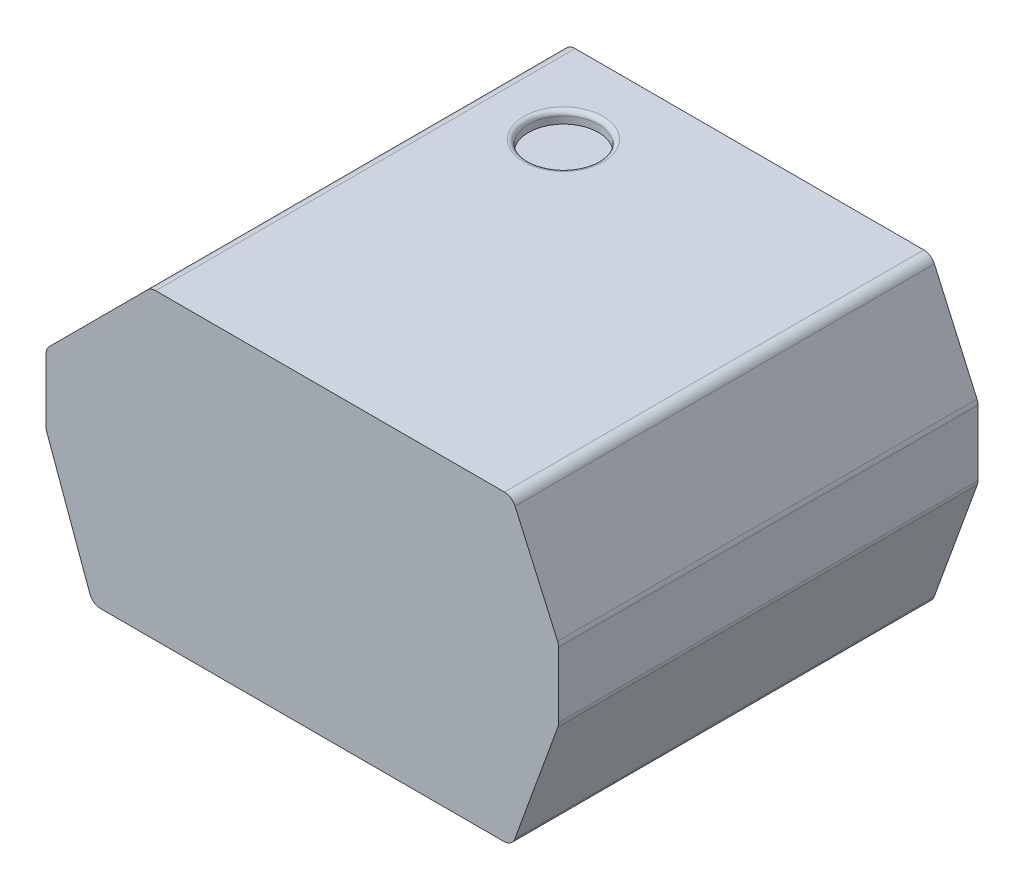
ISO-10303-21;
HEADER;
FILE_DESCRIPTION(('STEP AP214'),'2;1');
FILE_NAME('part.step','',(''),(''),'','','');
FILE_SCHEMA(('AUTOMOTIVE_DESIGN { 1 0 10303 214 1 1 1 1 }'));
ENDSEC;
DATA;
#1=APPLICATION_CONTEXT('core data for automotive mechanical design processes');
#2=APPLICATION_PROTOCOL_DEFINITION('international standard','automotive_design',2000,#1);
#3=PRODUCT_CONTEXT('',#1,'mechanical');
#4=PRODUCT('Part','Part','',(#3));
#5=PRODUCT_RELATED_PRODUCT_CATEGORY('part','',(#4));
#6=PRODUCT_DEFINITION_FORMATION('','',#4);
#7=PRODUCT_DEFINITION_CONTEXT('part definition',#1,'design');
#8=PRODUCT_DEFINITION('design','',#6,#7);
#9=PRODUCT_DEFINITION_SHAPE('','',#8);
#10=(LENGTH_UNIT() NAMED_UNIT(*) SI_UNIT(.MILLI.,.METRE.));
#11=(NAMED_UNIT(*) PLANE_ANGLE_UNIT() SI_UNIT($,.RADIAN.));
#12=(NAMED_UNIT(*) SI_UNIT($,.STERADIAN.) SOLID_ANGLE_UNIT());
#13=UNCERTAINTY_MEASURE_WITH_UNIT(LENGTH_MEASURE(1.E-05),#10,'distance_accuracy_value','');
#14=(GEOMETRIC_REPRESENTATION_CONTEXT(3) GLOBAL_UNCERTAINTY_ASSIGNED_CONTEXT((#13)) GLOBAL_UNIT_ASSIGNED_CONTEXT((#10,
#11,#12)) REPRESENTATION_CONTEXT('',''));
#15=CARTESIAN_POINT('',(0.,0.,0.));
#16=DIRECTION('',(0.,0.,1.));
#17=DIRECTION('',(1.,0.,0.));
#18=AXIS2_PLACEMENT_3D('',#15,#16,#17);
#19=CARTESIAN_POINT('',(1.56556133875729,2.6,0.723348656637227));
#20=DIRECTION('',(0.,1.,0.));
#21=DIRECTION('',(-1.,0.,0.));
#22=AXIS2_PLACEMENT_3D('',#19,#20,#21);
#23=PLANE('',#22);
#24=CARTESIAN_POINT('',(1.56556133875729,2.6,0.723348656637227));
#25=DIRECTION('',(0.,1.,0.));
#26=DIRECTION('',(-1.,0.,0.));
#27=AXIS2_PLACEMENT_3D('',#24,#25,#26);
#28=CIRCLE('',#27,0.3);
#29=CARTESIAN_POINT('',(1.26556133875729,2.6,0.723348656637227));
#30=VERTEX_POINT('',#29);
#31=EDGE_CURVE('E151',#30,#30,#28,.T.);
#32=ORIENTED_EDGE('',*,*,#31,.T.);
#33=EDGE_LOOP('',(#32));
#34=FACE_BOUND('',#33,.T.);
#35=ADVANCED_FACE('F16',(#34),#23,.T.);
#36=CARTESIAN_POINT('',(4.3,1.7787785549551,3.6));
#37=DIRECTION('',(0.,0.,-1.));
#38=DIRECTION('',(-1.,0.,0.));
#39=AXIS2_PLACEMENT_3D('',#36,#37,#38);
#40=CYLINDRICAL_SURFACE('',#39,0.1);
#41=CARTESIAN_POINT('',(4.3,1.7787785549551,3.6));
#42=DIRECTION('',(0.,0.,-1.));
#43=DIRECTION('',(-1.,0.,0.));
#44=AXIS2_PLACEMENT_3D('',#41,#42,#43);
#45=CIRCLE('',#44,0.1);
#46=CARTESIAN_POINT('',(4.39138115486203,1.81939240156044,3.6));
#47=VERTEX_POINT('',#46);
#48=CARTESIAN_POINT('',(4.4,1.7787785549551,3.6));
#49=VERTEX_POINT('',#48);
#50=EDGE_CURVE('E141',#47,#49,#45,.T.);
#51=ORIENTED_EDGE('',*,*,#50,.T.);
#52=DIRECTION('',(0.,0.,1.));
#53=VECTOR('',#52,1.);
#54=CARTESIAN_POINT('',(4.4,1.7787785549551,3.6));
#55=LINE('',#54,#53);
#56=CARTESIAN_POINT('',(4.4,1.7787785549551,0.));
#57=VERTEX_POINT('',#56);
#58=EDGE_CURVE('E140',#49,#57,#55,.F.);
#59=ORIENTED_EDGE('',*,*,#58,.T.);
#60=CARTESIAN_POINT('',(4.3,1.7787785549551,0.));
#61=DIRECTION('',(0.,0.,-1.));
#62=DIRECTION('',(-1.,0.,0.));
#63=AXIS2_PLACEMENT_3D('',#60,#61,#62);
#64=CIRCLE('',#63,0.1);
#65=CARTESIAN_POINT('',(4.39138115486203,1.81939240156044,0.));
#66=VERTEX_POINT('',#65);
#67=EDGE_CURVE('E131',#57,#66,#64,.F.);
#68=ORIENTED_EDGE('',*,*,#67,.T.);
#69=DIRECTION('',(0.,0.,1.));
#70=VECTOR('',#69,1.);
#71=CARTESIAN_POINT('',(4.39138115486203,1.81939240156044,3.6));
#72=LINE('',#71,#70);
#73=EDGE_CURVE('E138',#66,#47,#72,.T.);
#74=ORIENTED_EDGE('',*,*,#73,.T.);
#75=EDGE_LOOP('',(#51,#59,#68,#74));
#76=FACE_BOUND('',#75,.T.);
#77=ADVANCED_FACE('F137',(#76),#40,.T.);
#78=CARTESIAN_POINT('',(0.1,1.75857864376269,3.6));
#79=DIRECTION('',(0.,0.,-1.));
#80=DIRECTION('',(-1.,0.,0.));
#81=AXIS2_PLACEMENT_3D('',#78,#79,#80);
#82=CYLINDRICAL_SURFACE('',#81,0.1);
#83=CARTESIAN_POINT('',(0.1,1.75857864376269,3.6));
#84=DIRECTION('',(0.,0.,-1.));
#85=DIRECTION('',(-1.,0.,0.));
#86=AXIS2_PLACEMENT_3D('',#83,#84,#85);
#87=CIRCLE('',#86,0.1);
#88=CARTESIAN_POINT('',(0.,1.75857864376269,3.6));
#89=VERTEX_POINT('',#88);
#90=CARTESIAN_POINT('',(0.0292893218813454,1.82928932188135,3.6));
#91=VERTEX_POINT('',#90);
#92=EDGE_CURVE('E196',#89,#91,#87,.T.);
#93=ORIENTED_EDGE('',*,*,#92,.T.);
#94=DIRECTION('',(0.,0.,1.));
#95=VECTOR('',#94,1.);
#96=CARTESIAN_POINT('',(0.0292893218813456,1.82928932188135,3.6));
#97=LINE('',#96,#95);
#98=CARTESIAN_POINT('',(0.0292893218813454,1.82928932188135,0.));
#99=VERTEX_POINT('',#98);
#100=EDGE_CURVE('E160',#91,#99,#97,.F.);
#101=ORIENTED_EDGE('',*,*,#100,.T.);
#102=CARTESIAN_POINT('',(0.1,1.75857864376269,0.));
#103=DIRECTION('',(0.,0.,-1.));
#104=DIRECTION('',(-1.,0.,0.));
#105=AXIS2_PLACEMENT_3D('',#102,#103,#104);
#106=CIRCLE('',#105,0.1);
#107=CARTESIAN_POINT('',(0.,1.75857864376269,0.));
#108=VERTEX_POINT('',#107);
#109=EDGE_CURVE('E226',#99,#108,#106,.F.);
#110=ORIENTED_EDGE('',*,*,#109,.T.);
#111=DIRECTION('',(0.,0.,1.));
#112=VECTOR('',#111,1.);
#113=CARTESIAN_POINT('',(0.,1.75857864376269,3.6));
#114=LINE('',#113,#112);
#115=EDGE_CURVE('E183',#108,#89,#114,.T.);
#116=ORIENTED_EDGE('',*,*,#115,.T.);
#117=EDGE_LOOP('',(#93,#101,#110,#116));
#118=FACE_BOUND('',#117,.T.);
#119=ADVANCED_FACE('F376',(#118),#82,.T.);
#120=CARTESIAN_POINT('',(0.,1.75857864376269,3.6));
#121=DIRECTION('',(1.,0.,0.));
#122=DIRECTION('',(0.,1.,0.));
#123=AXIS2_PLACEMENT_3D('',#120,#121,#122);
#124=PLANE('',#123);
#125=DIRECTION('',(0.,0.,-1.));
#126=VECTOR('',#125,1.);
#127=CARTESIAN_POINT('',(0.,1.21761749776799,3.6));
#128=LINE('',#127,#126);
#129=CARTESIAN_POINT('',(0.,1.21761749776799,3.6));
#130=VERTEX_POINT('',#129);
#131=CARTESIAN_POINT('',(0.,1.21761749776799,0.));
#132=VERTEX_POINT('',#131);
#133=EDGE_CURVE('E184',#130,#132,#128,.T.);
#134=ORIENTED_EDGE('',*,*,#133,.F.);
#135=DIRECTION('',(0.,1.,0.));
#136=VECTOR('',#135,1.);
#137=CARTESIAN_POINT('',(0.,1.75857864376269,3.6));
#138=LINE('',#137,#136);
#139=EDGE_CURVE('E180',#89,#130,#138,.F.);
#140=ORIENTED_EDGE('',*,*,#139,.F.);
#141=ORIENTED_EDGE('',*,*,#115,.F.);
#142=DIRECTION('',(0.,1.,0.));
#143=VECTOR('',#142,1.);
#144=CARTESIAN_POINT('',(0.,1.75857864376269,0.));
#145=LINE('',#144,#143);
#146=EDGE_CURVE('E177',#132,#108,#145,.T.);
#147=ORIENTED_EDGE('',*,*,#146,.F.);
#148=EDGE_LOOP('',(#134,#140,#141,#147));
#149=FACE_BOUND('',#148,.T.);
#150=ADVANCED_FACE('F373',(#149),#124,.F.);
#151=CARTESIAN_POINT('',(4.4,1.21761749776799,3.6));
#152=DIRECTION('',(-1.,0.,0.));
#153=DIRECTION('',(0.,0.,1.));
#154=AXIS2_PLACEMENT_3D('',#151,#152,#153);
#155=PLANE('',#154);
#156=ORIENTED_EDGE('',*,*,#58,.F.);
#157=DIRECTION('',(0.,1.,0.));
#158=VECTOR('',#157,1.);
#159=CARTESIAN_POINT('',(4.4,1.21761749776799,3.6));
#160=LINE('',#159,#158);
#161=CARTESIAN_POINT('',(4.4,1.21761749776799,3.6));
#162=VERTEX_POINT('',#161);
#163=EDGE_CURVE('E174',#162,#49,#160,.T.);
#164=ORIENTED_EDGE('',*,*,#163,.F.);
#165=DIRECTION('',(0.,0.,-1.));
#166=VECTOR('',#165,1.);
#167=CARTESIAN_POINT('',(4.4,1.21761749776799,3.6));
#168=LINE('',#167,#166);
#169=CARTESIAN_POINT('',(4.4,1.21761749776799,0.));
#170=VERTEX_POINT('',#169);
#171=EDGE_CURVE('E170',#170,#162,#168,.F.);
#172=ORIENTED_EDGE('',*,*,#171,.F.);
#173=DIRECTION('',(0.,1.,0.));
#174=VECTOR('',#173,1.);
#175=CARTESIAN_POINT('',(4.4,1.21761749776799,0.));
#176=LINE('',#175,#174);
#177=EDGE_CURVE('E178',#57,#170,#176,.F.);
#178=ORIENTED_EDGE('',*,*,#177,.F.);
#179=EDGE_LOOP('',(#156,#164,#172,#178));
#180=FACE_BOUND('',#179,.T.);
#181=ADVANCED_FACE('F360',(#180),#155,.F.);
#182=CARTESIAN_POINT('',(1.56556133875729,2.6,0.723348656637227));
#183=DIRECTION('',(0.,1.,0.));
#184=DIRECTION('',(-1.,0.,0.));
#185=AXIS2_PLACEMENT_3D('',#182,#183,#184);
#186=CYLINDRICAL_SURFACE('',#185,0.3);
#187=ORIENTED_EDGE('',*,*,#31,.F.);
#188=EDGE_LOOP('',(#187));
#189=FACE_BOUND('',#188,.T.);
#190=CARTESIAN_POINT('',(1.56556133875729,2.66,0.723348656637227));
#191=DIRECTION('',(0.,-1.,0.));
#192=DIRECTION('',(1.,0.,0.));
#193=AXIS2_PLACEMENT_3D('',#190,#191,#192);
#194=CIRCLE('',#193,0.3);
#195=CARTESIAN_POINT('',(1.86556133875729,2.66,0.723348656637227));
#196=VERTEX_POINT('',#195);
#197=EDGE_CURVE('E166',#196,#196,#194,.T.);
#198=ORIENTED_EDGE('',*,*,#197,.F.);
#199=EDGE_LOOP('',(#198));
#200=FACE_BOUND('',#199,.T.);
#201=ADVANCED_FACE('F451',(#189,#200),#186,.F.);
#202=CARTESIAN_POINT('',(4.39138115486203,1.81939240156044,3.6));
#203=DIRECTION('',(-0.913811548620257,-0.406138466053447,0.));
#204=DIRECTION('',(0.406138466053447,-0.913811548620257,0.));
#205=AXIS2_PLACEMENT_3D('',#202,#203,#204);
#206=PLANE('',#205);
#207=DIRECTION('',(0.,0.,-1.));
#208=VECTOR('',#207,1.);
#209=CARTESIAN_POINT('',(4.02639384595318,2.64061384660535,3.6));
#210=LINE('',#209,#208);
#211=CARTESIAN_POINT('',(4.02639384595318,2.64061384660535,3.6));
#212=VERTEX_POINT('',#211);
#213=CARTESIAN_POINT('',(4.02639384595318,2.64061384660535,0.));
#214=VERTEX_POINT('',#213);
#215=EDGE_CURVE('E165',#212,#214,#210,.T.);
#216=ORIENTED_EDGE('',*,*,#215,.F.);
#217=DIRECTION('',(0.406138466053447,-0.913811548620257,0.));
#218=VECTOR('',#217,1.);
#219=CARTESIAN_POINT('',(4.39138115486203,1.81939240156044,3.6));
#220=LINE('',#219,#218);
#221=EDGE_CURVE('E150',#47,#212,#220,.F.);
#222=ORIENTED_EDGE('',*,*,#221,.F.);
#223=ORIENTED_EDGE('',*,*,#73,.F.);
#224=DIRECTION('',(0.406138466053447,-0.913811548620257,0.));
#225=VECTOR('',#224,1.);
#226=CARTESIAN_POINT('',(4.39138115486203,1.81939240156044,0.));
#227=LINE('',#226,#225);
#228=EDGE_CURVE('E147',#214,#66,#227,.T.);
#229=ORIENTED_EDGE('',*,*,#228,.F.);
#230=EDGE_LOOP('',(#216,#222,#223,#229));
#231=FACE_BOUND('',#230,.T.);
#232=ADVANCED_FACE('F146',(#231),#206,.F.);
#233=CARTESIAN_POINT('',(0.870710678118654,2.67071067811865,3.6));
#234=DIRECTION('',(0.707106781186548,-0.707106781186547,0.));
#235=DIRECTION('',(0.707106781186547,0.707106781186548,0.));
#236=AXIS2_PLACEMENT_3D('',#233,#234,#235);
#237=PLANE('',#236);
#238=ORIENTED_EDGE('',*,*,#100,.F.);
#239=DIRECTION('',(0.707106781186547,0.707106781186548,0.));
#240=VECTOR('',#239,1.);
#241=CARTESIAN_POINT('',(0.870710678118654,2.67071067811865,3.6));
#242=LINE('',#241,#240);
#243=CARTESIAN_POINT('',(0.870710678118655,2.67071067811865,3.6));
#244=VERTEX_POINT('',#243);
#245=EDGE_CURVE('E157',#244,#91,#242,.F.);
#246=ORIENTED_EDGE('',*,*,#245,.F.);
#247=DIRECTION('',(0.,0.,-1.));
#248=VECTOR('',#247,1.);
#249=CARTESIAN_POINT('',(0.870710678118654,2.67071067811865,3.6));
#250=LINE('',#249,#248);
#251=CARTESIAN_POINT('',(0.870710678118655,2.67071067811865,0.));
#252=VERTEX_POINT('',#251);
#253=EDGE_CURVE('E212',#252,#244,#250,.F.);
#254=ORIENTED_EDGE('',*,*,#253,.F.);
#255=DIRECTION('',(0.707106781186547,0.707106781186548,0.));
#256=VECTOR('',#255,1.);
#257=CARTESIAN_POINT('',(0.870710678118654,2.67071067811865,0.));
#258=LINE('',#257,#256);
#259=EDGE_CURVE('E191',#99,#252,#258,.T.);
#260=ORIENTED_EDGE('',*,*,#259,.F.);
#261=EDGE_LOOP('',(#238,#246,#254,#260));
#262=FACE_BOUND('',#261,.T.);
#263=ADVANCED_FACE('F285',(#262),#237,.F.);
#264=CARTESIAN_POINT('',(0.1,1.21761749776799,3.6));
#265=DIRECTION('',(0.,0.,-1.));
#266=DIRECTION('',(-1.,0.,0.));
#267=AXIS2_PLACEMENT_3D('',#264,#265,#266);
#268=CYLINDRICAL_SURFACE('',#267,0.1);
#269=CARTESIAN_POINT('',(0.1,1.21761749776799,3.6));
#270=DIRECTION('',(0.,0.,-1.));
#271=DIRECTION('',(-1.,0.,0.));
#272=AXIS2_PLACEMENT_3D('',#269,#270,#271);
#273=CIRCLE('',#272,0.1);
#274=CARTESIAN_POINT('',(0.00602065765115637,1.18344319145932,3.6));
#275=VERTEX_POINT('',#274);
#276=EDGE_CURVE('E187',#275,#130,#273,.T.);
#277=ORIENTED_EDGE('',*,*,#276,.T.);
#278=ORIENTED_EDGE('',*,*,#133,.T.);
#279=CARTESIAN_POINT('',(0.1,1.21761749776799,0.));
#280=DIRECTION('',(0.,0.,-1.));
#281=DIRECTION('',(-1.,0.,0.));
#282=AXIS2_PLACEMENT_3D('',#279,#280,#281);
#283=CIRCLE('',#282,0.1);
#284=CARTESIAN_POINT('',(0.00602065765115637,1.18344319145932,0.));
#285=VERTEX_POINT('',#284);
#286=EDGE_CURVE('E221',#132,#285,#283,.F.);
#287=ORIENTED_EDGE('',*,*,#286,.T.);
#288=DIRECTION('',(0.,0.,1.));
#289=VECTOR('',#288,1.);
#290=CARTESIAN_POINT('',(0.00602065765115643,1.18344319145932,3.6));
#291=LINE('',#290,#289);
#292=EDGE_CURVE('E211',#285,#275,#291,.T.);
#293=ORIENTED_EDGE('',*,*,#292,.T.);
#294=EDGE_LOOP('',(#277,#278,#287,#293));
#295=FACE_BOUND('',#294,.T.);
#296=ADVANCED_FACE('F369',(#295),#268,.T.);
#297=CARTESIAN_POINT('',(4.3,1.21761749776799,3.6));
#298=DIRECTION('',(0.,0.,-1.));
#299=DIRECTION('',(-1.,0.,0.));
#300=AXIS2_PLACEMENT_3D('',#297,#298,#299);
#301=CYLINDRICAL_SURFACE('',#300,0.1);
#302=CARTESIAN_POINT('',(4.3,1.21761749776799,3.6));
#303=DIRECTION('',(0.,0.,-1.));
#304=DIRECTION('',(-1.,0.,0.));
#305=AXIS2_PLACEMENT_3D('',#302,#303,#304);
#306=CIRCLE('',#305,0.1);
#307=CARTESIAN_POINT('',(4.39397934234884,1.18344319145932,3.6));
#308=VERTEX_POINT('',#307);
#309=EDGE_CURVE('E169',#162,#308,#306,.T.);
#310=ORIENTED_EDGE('',*,*,#309,.T.);
#311=DIRECTION('',(0.,0.,1.));
#312=VECTOR('',#311,1.);
#313=CARTESIAN_POINT('',(4.39397934234884,1.18344319145932,3.6));
#314=LINE('',#313,#312);
#315=CARTESIAN_POINT('',(4.39397934234884,1.18344319145932,0.));
#316=VERTEX_POINT('',#315);
#317=EDGE_CURVE('E242',#308,#316,#314,.F.);
#318=ORIENTED_EDGE('',*,*,#317,.T.);
#319=CARTESIAN_POINT('',(4.3,1.21761749776799,0.));
#320=DIRECTION('',(0.,0.,-1.));
#321=DIRECTION('',(-1.,0.,0.));
#322=AXIS2_PLACEMENT_3D('',#319,#320,#321);
#323=CIRCLE('',#322,0.1);
#324=EDGE_CURVE('E173',#316,#170,#323,.F.);
#325=ORIENTED_EDGE('',*,*,#324,.T.);
#326=ORIENTED_EDGE('',*,*,#171,.T.);
#327=EDGE_LOOP('',(#310,#318,#325,#326));
#328=FACE_BOUND('',#327,.T.);
#329=ADVANCED_FACE('F263',(#328),#301,.T.);
#330=CARTESIAN_POINT('',(1.56556133875729,2.66,0.723348656637227));
#331=DIRECTION('',(0.,-1.,0.));
#332=DIRECTION('',(1.,0.,0.));
#333=AXIS2_PLACEMENT_3D('',#330,#331,#332);
#334=TOROIDAL_SURFACE('',#333,0.34,0.04);
#335=CARTESIAN_POINT('',(1.56556133875729,2.7,0.723348656637227));
#336=DIRECTION('',(0.,1.,0.));
#337=DIRECTION('',(1.,0.,0.));
#338=AXIS2_PLACEMENT_3D('',#335,#336,#337);
#339=CIRCLE('',#338,0.34);
#340=CARTESIAN_POINT('',(1.90556133875729,2.7,0.723348656637227));
#341=VERTEX_POINT('',#340);
#342=CARTESIAN_POINT('',(1.22556133875729,2.7,0.723348656637227));
#343=VERTEX_POINT('',#342);
#344=EDGE_CURVE('E232',#341,#343,#339,.T.);
#345=ORIENTED_EDGE('',*,*,#344,.T.);
#346=CARTESIAN_POINT('',(1.56556133875729,2.7,0.723348656637227));
#347=DIRECTION('',(0.,1.,0.));
#348=DIRECTION('',(-1.,0.,0.));
#349=AXIS2_PLACEMENT_3D('',#346,#347,#348);
#350=CIRCLE('',#349,0.34);
#351=EDGE_CURVE('E236',#343,#341,#350,.T.);
#352=ORIENTED_EDGE('',*,*,#351,.T.);
#353=EDGE_LOOP('',(#345,#352));
#354=FACE_BOUND('',#353,.T.);
#355=ORIENTED_EDGE('',*,*,#197,.T.);
#356=EDGE_LOOP('',(#355));
#357=FACE_BOUND('',#356,.T.);
#358=ADVANCED_FACE('F233',(#354,#357),#334,.T.);
#359=CARTESIAN_POINT('',(3.93501269109115,2.6,3.6));
#360=DIRECTION('',(0.,0.,-1.));
#361=DIRECTION('',(-1.,0.,0.));
#362=AXIS2_PLACEMENT_3D('',#359,#360,#361);
#363=CYLINDRICAL_SURFACE('',#362,0.0999999999999998);
#364=CARTESIAN_POINT('',(3.93501269109115,2.6,3.6));
#365=DIRECTION('',(0.,0.,-1.));
#366=DIRECTION('',(-1.,0.,0.));
#367=AXIS2_PLACEMENT_3D('',#364,#365,#366);
#368=CIRCLE('',#367,0.0999999999999998);
#369=CARTESIAN_POINT('',(3.93501269109115,2.7,3.6));
#370=VERTEX_POINT('',#369);
#371=EDGE_CURVE('E215',#370,#212,#368,.T.);
#372=ORIENTED_EDGE('',*,*,#371,.T.);
#373=ORIENTED_EDGE('',*,*,#215,.T.);
#374=CARTESIAN_POINT('',(3.93501269109115,2.6,0.));
#375=DIRECTION('',(0.,0.,-1.));
#376=DIRECTION('',(-1.,0.,0.));
#377=AXIS2_PLACEMENT_3D('',#374,#375,#376);
#378=CIRCLE('',#377,0.0999999999999998);
#379=CARTESIAN_POINT('',(3.93501269109115,2.7,0.));
#380=VERTEX_POINT('',#379);
#381=EDGE_CURVE('E156',#214,#380,#378,.F.);
#382=ORIENTED_EDGE('',*,*,#381,.T.);
#383=DIRECTION('',(0.,0.,1.));
#384=VECTOR('',#383,1.);
#385=CARTESIAN_POINT('',(3.93501269109115,2.7,3.6));
#386=LINE('',#385,#384);
#387=EDGE_CURVE('E241',#380,#370,#386,.T.);
#388=ORIENTED_EDGE('',*,*,#387,.T.);
#389=EDGE_LOOP('',(#372,#373,#382,#388));
#390=FACE_BOUND('',#389,.T.);
#391=ADVANCED_FACE('F262',(#390),#363,.T.);
#392=CARTESIAN_POINT('',(0.94142135623731,2.6,3.6));
#393=DIRECTION('',(0.,0.,-1.));
#394=DIRECTION('',(-1.,0.,0.));
#395=AXIS2_PLACEMENT_3D('',#392,#393,#394);
#396=CYLINDRICAL_SURFACE('',#395,0.0999999999999999);
#397=CARTESIAN_POINT('',(0.94142135623731,2.6,3.6));
#398=DIRECTION('',(0.,0.,-1.));
#399=DIRECTION('',(-1.,0.,0.));
#400=AXIS2_PLACEMENT_3D('',#397,#398,#399);
#401=CIRCLE('',#400,0.0999999999999999);
#402=CARTESIAN_POINT('',(0.94142135623731,2.7,3.6));
#403=VERTEX_POINT('',#402);
#404=EDGE_CURVE('E209',#244,#403,#401,.T.);
#405=ORIENTED_EDGE('',*,*,#404,.T.);
#406=DIRECTION('',(0.,0.,1.));
#407=VECTOR('',#406,1.);
#408=CARTESIAN_POINT('',(0.94142135623731,2.7,3.6));
#409=LINE('',#408,#407);
#410=CARTESIAN_POINT('',(0.94142135623731,2.7,0.));
#411=VERTEX_POINT('',#410);
#412=EDGE_CURVE('E334',#403,#411,#409,.F.);
#413=ORIENTED_EDGE('',*,*,#412,.T.);
#414=CARTESIAN_POINT('',(0.94142135623731,2.6,0.));
#415=DIRECTION('',(0.,0.,-1.));
#416=DIRECTION('',(-1.,0.,0.));
#417=AXIS2_PLACEMENT_3D('',#414,#415,#416);
#418=CIRCLE('',#417,0.0999999999999999);
#419=EDGE_CURVE('E213',#411,#252,#418,.F.);
#420=ORIENTED_EDGE('',*,*,#419,.T.);
#421=ORIENTED_EDGE('',*,*,#253,.T.);
#422=EDGE_LOOP('',(#405,#413,#420,#421));
#423=FACE_BOUND('',#422,.T.);
#424=ADVANCED_FACE('F288',(#423),#396,.T.);
#425=CARTESIAN_POINT('',(0.00602065765115643,1.18344319145932,3.6));
#426=DIRECTION('',(0.939793423488437,0.341743063086704,0.));
#427=DIRECTION('',(-0.341743063086704,0.939793423488437,0.));
#428=AXIS2_PLACEMENT_3D('',#425,#426,#427);
#429=PLANE('',#428);
#430=DIRECTION('',(0.,0.,-1.));
#431=VECTOR('',#430,1.);
#432=CARTESIAN_POINT('',(0.376063384112244,0.16582569369133,3.6));
#433=LINE('',#432,#431);
#434=CARTESIAN_POINT('',(0.376063384112244,0.16582569369133,3.6));
#435=VERTEX_POINT('',#434);
#436=CARTESIAN_POINT('',(0.376063384112244,0.16582569369133,0.));
#437=VERTEX_POINT('',#436);
#438=EDGE_CURVE('E208',#435,#437,#433,.T.);
#439=ORIENTED_EDGE('',*,*,#438,.F.);
#440=DIRECTION('',(-0.341743063086704,0.939793423488437,0.));
#441=VECTOR('',#440,1.);
#442=CARTESIAN_POINT('',(0.00602065765115643,1.18344319145932,3.6));
#443=LINE('',#442,#441);
#444=EDGE_CURVE('E252',#275,#435,#443,.F.);
#445=ORIENTED_EDGE('',*,*,#444,.F.);
#446=ORIENTED_EDGE('',*,*,#292,.F.);
#447=DIRECTION('',(-0.341743063086704,0.939793423488437,0.));
#448=VECTOR('',#447,1.);
#449=CARTESIAN_POINT('',(0.00602065765115643,1.18344319145932,0.));
#450=LINE('',#449,#448);
#451=EDGE_CURVE('E247',#437,#285,#450,.T.);
#452=ORIENTED_EDGE('',*,*,#451,.F.);
#453=EDGE_LOOP('',(#439,#445,#446,#452));
#454=FACE_BOUND('',#453,.T.);
#455=ADVANCED_FACE('F367',(#454),#429,.F.);
#456=CARTESIAN_POINT('',(4.02393661588776,0.16582569369133,3.6));
#457=DIRECTION('',(-0.939793423488437,0.341743063086705,0.));
#458=DIRECTION('',(-0.341743063086705,-0.939793423488437,0.));
#459=AXIS2_PLACEMENT_3D('',#456,#457,#458);
#460=PLANE('',#459);
#461=ORIENTED_EDGE('',*,*,#317,.F.);
#462=DIRECTION('',(0.341743063086705,0.939793423488437,0.));
#463=VECTOR('',#462,1.);
#464=CARTESIAN_POINT('',(4.02393661588776,0.16582569369133,3.6));
#465=LINE('',#464,#463);
#466=CARTESIAN_POINT('',(4.02393661588776,0.16582569369133,3.6));
#467=VERTEX_POINT('',#466);
#468=EDGE_CURVE('E207',#467,#308,#465,.T.);
#469=ORIENTED_EDGE('',*,*,#468,.F.);
#470=DIRECTION('',(0.,0.,-1.));
#471=VECTOR('',#470,1.);
#472=CARTESIAN_POINT('',(4.02393661588775,0.16582569369133,3.6));
#473=LINE('',#472,#471);
#474=CARTESIAN_POINT('',(4.02393661588776,0.16582569369133,0.));
#475=VERTEX_POINT('',#474);
#476=EDGE_CURVE('E204',#475,#467,#473,.F.);
#477=ORIENTED_EDGE('',*,*,#476,.F.);
#478=DIRECTION('',(-0.341743063086705,-0.939793423488437,0.));
#479=VECTOR('',#478,1.);
#480=CARTESIAN_POINT('',(4.02393661588776,0.16582569369133,0.));
#481=LINE('',#480,#479);
#482=EDGE_CURVE('E240',#316,#475,#481,.T.);
#483=ORIENTED_EDGE('',*,*,#482,.F.);
#484=EDGE_LOOP('',(#461,#469,#477,#483));
#485=FACE_BOUND('',#484,.T.);
#486=ADVANCED_FACE('F321',(#485),#460,.F.);
#487=CARTESIAN_POINT('',(3.93501269109115,2.7,3.6));
#488=DIRECTION('',(0.,-1.,0.));
#489=DIRECTION('',(1.,0.,0.));
#490=AXIS2_PLACEMENT_3D('',#487,#488,#489);
#491=PLANE('',#490);
#492=ORIENTED_EDGE('',*,*,#412,.F.);
#493=DIRECTION('',(1.,0.,0.));
#494=VECTOR('',#493,1.);
#495=CARTESIAN_POINT('',(0.94142135623731,2.7,3.6));
#496=LINE('',#495,#494);
#497=EDGE_CURVE('E294',#370,#403,#496,.F.);
#498=ORIENTED_EDGE('',*,*,#497,.F.);
#499=ORIENTED_EDGE('',*,*,#387,.F.);
#500=DIRECTION('',(1.,0.,0.));
#501=VECTOR('',#500,1.);
#502=CARTESIAN_POINT('',(0.94142135623731,2.7,0.));
#503=LINE('',#502,#501);
#504=EDGE_CURVE('E198',#380,#411,#503,.F.);
#505=ORIENTED_EDGE('',*,*,#504,.T.);
#506=EDGE_LOOP('',(#492,#498,#499,#505));
#507=FACE_BOUND('',#506,.T.);
#508=ORIENTED_EDGE('',*,*,#344,.F.);
#509=ORIENTED_EDGE('',*,*,#351,.F.);
#510=EDGE_LOOP('',(#508,#509));
#511=FACE_BOUND('',#510,.T.);
#512=ADVANCED_FACE('F310',(#507,#511),#491,.F.);
#513=CARTESIAN_POINT('',(0.470042726461087,0.2,3.6));
#514=DIRECTION('',(0.,0.,-1.));
#515=DIRECTION('',(-1.,0.,0.));
#516=AXIS2_PLACEMENT_3D('',#513,#514,#515);
#517=CYLINDRICAL_SURFACE('',#516,0.1);
#518=CARTESIAN_POINT('',(0.470042726461087,0.2,3.6));
#519=DIRECTION('',(0.,0.,-1.));
#520=DIRECTION('',(-1.,0.,0.));
#521=AXIS2_PLACEMENT_3D('',#518,#519,#520);
#522=CIRCLE('',#521,0.1);
#523=CARTESIAN_POINT('',(0.470042726461088,0.1,3.6));
#524=VERTEX_POINT('',#523);
#525=EDGE_CURVE('E205',#435,#524,#522,.F.);
#526=ORIENTED_EDGE('',*,*,#525,.F.);
#527=ORIENTED_EDGE('',*,*,#438,.T.);
#528=CARTESIAN_POINT('',(0.470042726461087,0.2,0.));
#529=DIRECTION('',(0.,0.,-1.));
#530=DIRECTION('',(-1.,0.,0.));
#531=AXIS2_PLACEMENT_3D('',#528,#529,#530);
#532=CIRCLE('',#531,0.1);
#533=CARTESIAN_POINT('',(0.470042726461088,0.1,0.));
#534=VERTEX_POINT('',#533);
#535=EDGE_CURVE('E199',#437,#534,#532,.F.);
#536=ORIENTED_EDGE('',*,*,#535,.T.);
#537=DIRECTION('',(0.,0.,1.));
#538=VECTOR('',#537,1.);
#539=CARTESIAN_POINT('',(0.470042726461088,0.1,3.6));
#540=LINE('',#539,#538);
#541=EDGE_CURVE('E351',#534,#524,#540,.T.);
#542=ORIENTED_EDGE('',*,*,#541,.T.);
#543=EDGE_LOOP('',(#526,#527,#536,#542));
#544=FACE_BOUND('',#543,.T.);
#545=ADVANCED_FACE('F320',(#544),#517,.T.);
#546=CARTESIAN_POINT('',(0.94142135623731,2.6,3.6));
#547=DIRECTION('',(0.,0.,1.));
#548=DIRECTION('',(1.,0.,0.));
#549=AXIS2_PLACEMENT_3D('',#546,#547,#548);
#550=PLANE('',#549);
#551=ORIENTED_EDGE('',*,*,#371,.F.);
#552=ORIENTED_EDGE('',*,*,#497,.T.);
#553=ORIENTED_EDGE('',*,*,#404,.F.);
#554=ORIENTED_EDGE('',*,*,#245,.T.);
#555=ORIENTED_EDGE('',*,*,#92,.F.);
#556=ORIENTED_EDGE('',*,*,#139,.T.);
#557=ORIENTED_EDGE('',*,*,#276,.F.);
#558=ORIENTED_EDGE('',*,*,#444,.T.);
#559=ORIENTED_EDGE('',*,*,#525,.T.);
#560=DIRECTION('',(1.,0.,0.));
#561=VECTOR('',#560,1.);
#562=CARTESIAN_POINT('',(0.470042726461088,0.1,3.6));
#563=LINE('',#562,#561);
#564=CARTESIAN_POINT('',(3.92995727353891,0.1,3.6));
#565=VERTEX_POINT('',#564);
#566=EDGE_CURVE('E302',#524,#565,#563,.T.);
#567=ORIENTED_EDGE('',*,*,#566,.T.);
#568=CARTESIAN_POINT('',(3.92995727353891,0.2,3.6));
#569=DIRECTION('',(0.,0.,-1.));
#570=DIRECTION('',(-1.,0.,0.));
#571=AXIS2_PLACEMENT_3D('',#568,#569,#570);
#572=CIRCLE('',#571,0.0999999999999998);
#573=EDGE_CURVE('E202',#467,#565,#572,.T.);
#574=ORIENTED_EDGE('',*,*,#573,.F.);
#575=ORIENTED_EDGE('',*,*,#468,.T.);
#576=ORIENTED_EDGE('',*,*,#309,.F.);
#577=ORIENTED_EDGE('',*,*,#163,.T.);
#578=ORIENTED_EDGE('',*,*,#50,.F.);
#579=ORIENTED_EDGE('',*,*,#221,.T.);
#580=EDGE_LOOP('',(#551,#552,#553,#554,#555,#556,#557,#558,#559,#567,#574,#575,#576,#577,#578,#579));
#581=FACE_BOUND('',#580,.T.);
#582=ADVANCED_FACE('F292',(#581),#550,.T.);
#583=CARTESIAN_POINT('',(3.92995727353891,0.2,3.6));
#584=DIRECTION('',(0.,0.,-1.));
#585=DIRECTION('',(-1.,0.,0.));
#586=AXIS2_PLACEMENT_3D('',#583,#584,#585);
#587=CYLINDRICAL_SURFACE('',#586,0.0999999999999998);
#588=ORIENTED_EDGE('',*,*,#573,.T.);
#589=DIRECTION('',(0.,0.,1.));
#590=VECTOR('',#589,1.);
#591=CARTESIAN_POINT('',(3.92995727353891,0.1,3.6));
#592=LINE('',#591,#590);
#593=CARTESIAN_POINT('',(3.92995727353891,0.1,0.));
#594=VERTEX_POINT('',#593);
#595=EDGE_CURVE('E27',#565,#594,#592,.F.);
#596=ORIENTED_EDGE('',*,*,#595,.T.);
#597=CARTESIAN_POINT('',(3.92995727353891,0.2,0.));
#598=DIRECTION('',(0.,0.,-1.));
#599=DIRECTION('',(-1.,0.,0.));
#600=AXIS2_PLACEMENT_3D('',#597,#598,#599);
#601=CIRCLE('',#600,0.0999999999999998);
#602=EDGE_CURVE('E35',#594,#475,#601,.F.);
#603=ORIENTED_EDGE('',*,*,#602,.T.);
#604=ORIENTED_EDGE('',*,*,#476,.T.);
#605=EDGE_LOOP('',(#588,#596,#603,#604));
#606=FACE_BOUND('',#605,.T.);
#607=ADVANCED_FACE('F353',(#606),#587,.T.);
#608=CARTESIAN_POINT('',(0.94142135623731,2.6,0.));
#609=DIRECTION('',(0.,0.,1.));
#610=DIRECTION('',(1.,0.,0.));
#611=AXIS2_PLACEMENT_3D('',#608,#609,#610);
#612=PLANE('',#611);
#613=ORIENTED_EDGE('',*,*,#504,.F.);
#614=ORIENTED_EDGE('',*,*,#381,.F.);
#615=ORIENTED_EDGE('',*,*,#228,.T.);
#616=ORIENTED_EDGE('',*,*,#67,.F.);
#617=ORIENTED_EDGE('',*,*,#177,.T.);
#618=ORIENTED_EDGE('',*,*,#324,.F.);
#619=ORIENTED_EDGE('',*,*,#482,.T.);
#620=ORIENTED_EDGE('',*,*,#602,.F.);
#621=DIRECTION('',(1.,0.,0.));
#622=VECTOR('',#621,1.);
#623=CARTESIAN_POINT('',(0.470042726461088,0.1,0.));
#624=LINE('',#623,#622);
#625=EDGE_CURVE('E11',#594,#534,#624,.F.);
#626=ORIENTED_EDGE('',*,*,#625,.T.);
#627=ORIENTED_EDGE('',*,*,#535,.F.);
#628=ORIENTED_EDGE('',*,*,#451,.T.);
#629=ORIENTED_EDGE('',*,*,#286,.F.);
#630=ORIENTED_EDGE('',*,*,#146,.T.);
#631=ORIENTED_EDGE('',*,*,#109,.F.);
#632=ORIENTED_EDGE('',*,*,#259,.T.);
#633=ORIENTED_EDGE('',*,*,#419,.F.);
#634=EDGE_LOOP('',(#613,#614,#615,#616,#617,#618,#619,#620,#626,#627,#628,#629,#630,#631,#632,#633));
#635=FACE_BOUND('',#634,.T.);
#636=ADVANCED_FACE('F155',(#635),#612,.F.);
#637=CARTESIAN_POINT('',(0.470042726461088,0.1,3.6));
#638=DIRECTION('',(0.,1.,0.));
#639=DIRECTION('',(0.,0.,1.));
#640=AXIS2_PLACEMENT_3D('',#637,#638,#639);
#641=PLANE('',#640);
#642=ORIENTED_EDGE('',*,*,#595,.F.);
#643=ORIENTED_EDGE('',*,*,#566,.F.);
#644=ORIENTED_EDGE('',*,*,#541,.F.);
#645=ORIENTED_EDGE('',*,*,#625,.F.);
#646=EDGE_LOOP('',(#642,#643,#644,#645));
#647=FACE_BOUND('',#646,.T.);
#648=ADVANCED_FACE('F348',(#647),#641,.F.);
#649=CLOSED_SHELL('',(#35,#77,#119,#150,#181,#201,#232,#263,#296,#329,#358,#391,#424,#455,#486,
#512,#545,#582,#607,#636,#648));
#650=MANIFOLD_SOLID_BREP('B1',#649);
#651=ADVANCED_BREP_SHAPE_REPRESENTATION('',(#18,#650),#14);
#652=SHAPE_DEFINITION_REPRESENTATION(#9,#651);
ENDSEC;
END-ISO-10303-21;
